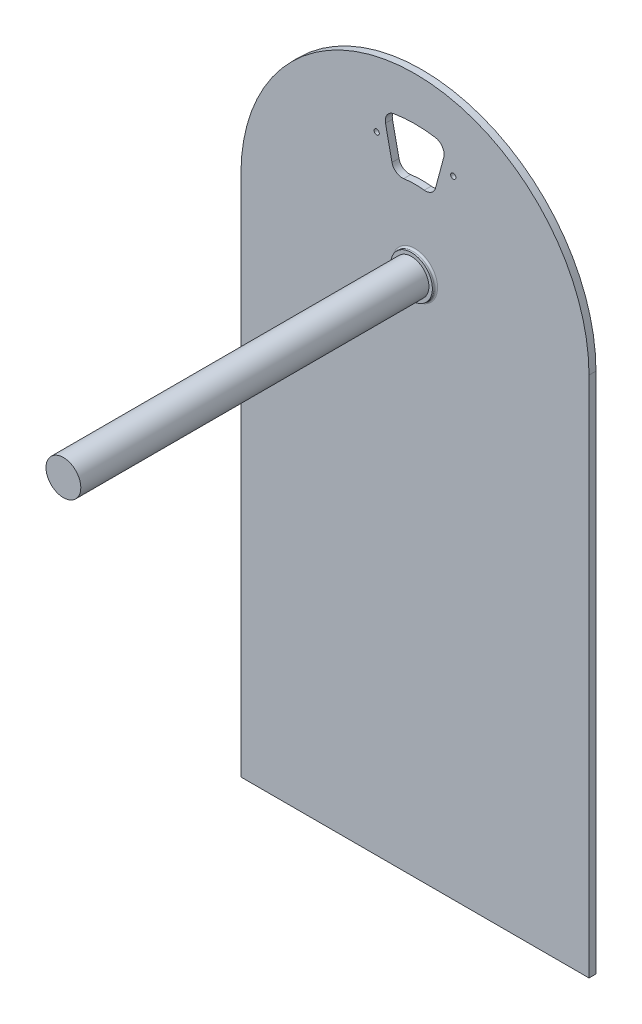
ISO-10303-21;
HEADER;
FILE_DESCRIPTION(('STEP AP214'),'2;1');
FILE_NAME('part.step','',(''),(''),'','','');
FILE_SCHEMA(('AUTOMOTIVE_DESIGN { 1 0 10303 214 1 1 1 1 }'));
ENDSEC;
DATA;
#1=APPLICATION_CONTEXT('core data for automotive mechanical design processes');
#2=APPLICATION_PROTOCOL_DEFINITION('international standard','automotive_design',2000,#1);
#3=PRODUCT_CONTEXT('',#1,'mechanical');
#4=PRODUCT('Part','Part','',(#3));
#5=PRODUCT_RELATED_PRODUCT_CATEGORY('part','',(#4));
#6=PRODUCT_DEFINITION_FORMATION('','',#4);
#7=PRODUCT_DEFINITION_CONTEXT('part definition',#1,'design');
#8=PRODUCT_DEFINITION('design','',#6,#7);
#9=PRODUCT_DEFINITION_SHAPE('','',#8);
#10=(LENGTH_UNIT() NAMED_UNIT(*) SI_UNIT(.MILLI.,.METRE.));
#11=(NAMED_UNIT(*) PLANE_ANGLE_UNIT() SI_UNIT($,.RADIAN.));
#12=(NAMED_UNIT(*) SI_UNIT($,.STERADIAN.) SOLID_ANGLE_UNIT());
#13=UNCERTAINTY_MEASURE_WITH_UNIT(LENGTH_MEASURE(1.E-05),#10,'distance_accuracy_value','');
#14=(GEOMETRIC_REPRESENTATION_CONTEXT(3) GLOBAL_UNCERTAINTY_ASSIGNED_CONTEXT((#13)) GLOBAL_UNIT_ASSIGNED_CONTEXT((#10,
#11,#12)) REPRESENTATION_CONTEXT('',''));
#15=CARTESIAN_POINT('',(0.,0.,0.));
#16=DIRECTION('',(0.,0.,1.));
#17=DIRECTION('',(1.,0.,0.));
#18=AXIS2_PLACEMENT_3D('',#15,#16,#17);
#19=CARTESIAN_POINT('',(0.,0.,2.));
#20=DIRECTION('',(0.,0.,1.));
#21=DIRECTION('',(1.,0.,0.));
#22=AXIS2_PLACEMENT_3D('',#19,#20,#21);
#23=PLANE('',#22);
#24=CARTESIAN_POINT('',(0.,0.,2.));
#25=DIRECTION('',(0.,0.,1.));
#26=DIRECTION('',(1.,0.,0.));
#27=AXIS2_PLACEMENT_3D('',#24,#25,#26);
#28=CIRCLE('',#27,6.5);
#29=CARTESIAN_POINT('',(6.5,0.,2.));
#30=VERTEX_POINT('',#29);
#31=EDGE_CURVE('E11',#30,#30,#28,.F.);
#32=ORIENTED_EDGE('',*,*,#31,.T.);
#33=EDGE_LOOP('',(#32));
#34=FACE_BOUND('',#33,.T.);
#35=DIRECTION('',(0.,1.,0.));
#36=VECTOR('',#35,1.);
#37=CARTESIAN_POINT('',(50.,-150.,2.));
#38=LINE('',#37,#36);
#39=CARTESIAN_POINT('',(50.,-150.,2.));
#40=VERTEX_POINT('',#39);
#41=CARTESIAN_POINT('',(50.,0.,2.));
#42=VERTEX_POINT('',#41);
#43=EDGE_CURVE('E146',#40,#42,#38,.T.);
#44=ORIENTED_EDGE('',*,*,#43,.T.);
#45=CARTESIAN_POINT('',(0.,0.,2.));
#46=DIRECTION('',(0.,0.,1.));
#47=DIRECTION('',(1.,0.,0.));
#48=AXIS2_PLACEMENT_3D('',#45,#46,#47);
#49=CIRCLE('',#48,50.);
#50=CARTESIAN_POINT('',(-50.,0.,2.));
#51=VERTEX_POINT('',#50);
#52=EDGE_CURVE('E145',#42,#51,#49,.T.);
#53=ORIENTED_EDGE('',*,*,#52,.T.);
#54=DIRECTION('',(0.,-1.,0.));
#55=VECTOR('',#54,1.);
#56=CARTESIAN_POINT('',(-50.,-150.,2.));
#57=LINE('',#56,#55);
#58=CARTESIAN_POINT('',(-50.,-150.,2.));
#59=VERTEX_POINT('',#58);
#60=EDGE_CURVE('E133',#51,#59,#57,.T.);
#61=ORIENTED_EDGE('',*,*,#60,.T.);
#62=DIRECTION('',(1.,0.,0.));
#63=VECTOR('',#62,1.);
#64=CARTESIAN_POINT('',(-50.,-150.,2.));
#65=LINE('',#64,#63);
#66=EDGE_CURVE('E144',#59,#40,#65,.T.);
#67=ORIENTED_EDGE('',*,*,#66,.T.);
#68=EDGE_LOOP('',(#44,#53,#61,#67));
#69=FACE_BOUND('',#68,.T.);
#70=CARTESIAN_POINT('',(11.,30.,2.));
#71=DIRECTION('',(0.,0.,1.));
#72=DIRECTION('',(1.,0.,0.));
#73=AXIS2_PLACEMENT_3D('',#70,#71,#72);
#74=CIRCLE('',#73,0.75);
#75=CARTESIAN_POINT('',(11.75,30.,2.));
#76=VERTEX_POINT('',#75);
#77=EDGE_CURVE('E169',#76,#76,#74,.T.);
#78=ORIENTED_EDGE('',*,*,#77,.F.);
#79=EDGE_LOOP('',(#78));
#80=FACE_BOUND('',#79,.T.);
#81=CARTESIAN_POINT('',(-10.9999999999998,30.,2.));
#82=DIRECTION('',(0.,0.,1.));
#83=DIRECTION('',(1.,0.,0.));
#84=AXIS2_PLACEMENT_3D('',#81,#82,#83);
#85=CIRCLE('',#84,0.75);
#86=CARTESIAN_POINT('',(-10.2499999999998,30.,2.));
#87=VERTEX_POINT('',#86);
#88=EDGE_CURVE('E162',#87,#87,#85,.T.);
#89=ORIENTED_EDGE('',*,*,#88,.F.);
#90=EDGE_LOOP('',(#89));
#91=FACE_BOUND('',#90,.T.);
#92=DIRECTION('',(0.258819045102509,0.965925826289072,0.));
#93=VECTOR('',#92,1.);
#94=CARTESIAN_POINT('',(8.26740860120209,33.3031124278494,2.));
#95=LINE('',#94,#93);
#96=CARTESIAN_POINT('',(5.9203506607565,24.5437729457981,2.));
#97=VERTEX_POINT('',#96);
#98=CARTESIAN_POINT('',(8.26740860120209,33.3031124278494,2.));
#99=VERTEX_POINT('',#98);
#100=EDGE_CURVE('E184',#97,#99,#95,.T.);
#101=ORIENTED_EDGE('',*,*,#100,.F.);
#102=CARTESIAN_POINT('',(3.02257318188928,25.3202300811056,2.));
#103=DIRECTION('',(0.,0.,1.));
#104=DIRECTION('',(-1.,0.,0.));
#105=AXIS2_PLACEMENT_3D('',#102,#103,#104);
#106=CIRCLE('',#105,3.);
#107=CARTESIAN_POINT('',(2.66697633696114,22.3413794833284,2.));
#108=VERTEX_POINT('',#107);
#109=EDGE_CURVE('E182',#108,#97,#106,.T.);
#110=ORIENTED_EDGE('',*,*,#109,.F.);
#111=CARTESIAN_POINT('',(0.,0.,2.));
#112=DIRECTION('',(0.,0.,-1.));
#113=DIRECTION('',(1.,0.,0.));
#114=AXIS2_PLACEMENT_3D('',#111,#112,#113);
#115=CIRCLE('',#114,22.5);
#116=CARTESIAN_POINT('',(-3.22612506838159,22.2675125921859,2.));
#117=VERTEX_POINT('',#116);
#118=EDGE_CURVE('E198',#117,#108,#115,.T.);
#119=ORIENTED_EDGE('',*,*,#118,.F.);
#120=CARTESIAN_POINT('',(-3.65627507749914,25.2365142711441,2.));
#121=DIRECTION('',(0.,0.,1.));
#122=DIRECTION('',(1.,0.,0.));
#123=AXIS2_PLACEMENT_3D('',#120,#121,#122);
#124=CIRCLE('',#123,3.);
#125=CARTESIAN_POINT('',(-6.59071787970056,24.6127791986908,2.));
#126=VERTEX_POINT('',#125);
#127=EDGE_CURVE('E195',#126,#117,#124,.T.);
#128=ORIENTED_EDGE('',*,*,#127,.F.);
#129=DIRECTION('',(0.207911690817753,-0.978147600733807,0.));
#130=VECTOR('',#129,1.);
#131=CARTESIAN_POINT('',(-8.46489844953987,33.4301055381566,2.));
#132=LINE('',#131,#130);
#133=CARTESIAN_POINT('',(-8.46489844953988,33.4301055381566,2.));
#134=VERTEX_POINT('',#133);
#135=EDGE_CURVE('E193',#134,#126,#132,.T.);
#136=ORIENTED_EDGE('',*,*,#135,.F.);
#137=CARTESIAN_POINT('',(-5.53045564733845,34.0538406106099,2.));
#138=DIRECTION('',(0.,0.,1.));
#139=DIRECTION('',(-1.,0.,0.));
#140=AXIS2_PLACEMENT_3D('',#137,#138,#139);
#141=CIRCLE('',#140,3.00000000000001);
#142=CARTESIAN_POINT('',(-6.01136483406354,37.0150441419673,2.));
#143=VERTEX_POINT('',#142);
#144=EDGE_CURVE('E191',#143,#134,#141,.T.);
#145=ORIENTED_EDGE('',*,*,#144,.F.);
#146=CARTESIAN_POINT('',(0.,0.,2.));
#147=DIRECTION('',(0.,0.,1.));
#148=DIRECTION('',(1.,0.,0.));
#149=AXIS2_PLACEMENT_3D('',#146,#147,#148);
#150=CIRCLE('',#149,37.5);
#151=CARTESIAN_POINT('',(5.8365555677553,37.0430103947358,2.));
#152=VERTEX_POINT('',#151);
#153=EDGE_CURVE('E189',#152,#143,#150,.T.);
#154=ORIENTED_EDGE('',*,*,#153,.F.);
#155=CARTESIAN_POINT('',(5.36963112233488,34.0795695631569,2.));
#156=DIRECTION('',(0.,0.,1.));
#157=DIRECTION('',(1.,0.,0.));
#158=AXIS2_PLACEMENT_3D('',#155,#156,#157);
#159=CIRCLE('',#158,3.00000000000001);
#160=EDGE_CURVE('E187',#99,#152,#159,.T.);
#161=ORIENTED_EDGE('',*,*,#160,.F.);
#162=EDGE_LOOP('',(#101,#110,#119,#128,#136,#145,#154,#161));
#163=FACE_BOUND('',#162,.T.);
#164=ADVANCED_FACE('F41',(#34,#69,#80,#91,#163),#23,.T.);
#165=CARTESIAN_POINT('',(0.,0.,0.));
#166=DIRECTION('',(0.,0.,1.));
#167=DIRECTION('',(1.,0.,0.));
#168=AXIS2_PLACEMENT_3D('',#165,#166,#167);
#169=PLANE('',#168);
#170=CARTESIAN_POINT('',(11.,30.,0.));
#171=DIRECTION('',(0.,0.,-1.));
#172=DIRECTION('',(-1.,0.,0.));
#173=AXIS2_PLACEMENT_3D('',#170,#171,#172);
#174=CIRCLE('',#173,0.75);
#175=CARTESIAN_POINT('',(10.25,30.,0.));
#176=VERTEX_POINT('',#175);
#177=EDGE_CURVE('E159',#176,#176,#174,.T.);
#178=ORIENTED_EDGE('',*,*,#177,.F.);
#179=EDGE_LOOP('',(#178));
#180=FACE_BOUND('',#179,.T.);
#181=CARTESIAN_POINT('',(-10.9999999999998,30.,0.));
#182=DIRECTION('',(0.,0.,-1.));
#183=DIRECTION('',(1.,0.,0.));
#184=AXIS2_PLACEMENT_3D('',#181,#182,#183);
#185=CIRCLE('',#184,0.75);
#186=CARTESIAN_POINT('',(-10.2499999999998,30.,0.));
#187=VERTEX_POINT('',#186);
#188=EDGE_CURVE('E163',#187,#187,#185,.T.);
#189=ORIENTED_EDGE('',*,*,#188,.F.);
#190=EDGE_LOOP('',(#189));
#191=FACE_BOUND('',#190,.T.);
#192=CARTESIAN_POINT('',(0.,0.,0.));
#193=DIRECTION('',(0.,0.,1.));
#194=DIRECTION('',(1.,0.,0.));
#195=AXIS2_PLACEMENT_3D('',#192,#193,#194);
#196=CIRCLE('',#195,50.);
#197=CARTESIAN_POINT('',(50.,0.,0.));
#198=VERTEX_POINT('',#197);
#199=CARTESIAN_POINT('',(-50.,0.,0.));
#200=VERTEX_POINT('',#199);
#201=EDGE_CURVE('E56',#198,#200,#196,.T.);
#202=ORIENTED_EDGE('',*,*,#201,.F.);
#203=DIRECTION('',(0.,-1.,0.));
#204=VECTOR('',#203,1.);
#205=CARTESIAN_POINT('',(50.,-150.,0.));
#206=LINE('',#205,#204);
#207=CARTESIAN_POINT('',(50.,-150.,0.));
#208=VERTEX_POINT('',#207);
#209=EDGE_CURVE('E166',#198,#208,#206,.T.);
#210=ORIENTED_EDGE('',*,*,#209,.T.);
#211=DIRECTION('',(-1.,0.,0.));
#212=VECTOR('',#211,1.);
#213=CARTESIAN_POINT('',(-50.,-150.,0.));
#214=LINE('',#213,#212);
#215=CARTESIAN_POINT('',(-50.,-150.,0.));
#216=VERTEX_POINT('',#215);
#217=EDGE_CURVE('E289',#208,#216,#214,.T.);
#218=ORIENTED_EDGE('',*,*,#217,.T.);
#219=DIRECTION('',(0.,1.,0.));
#220=VECTOR('',#219,1.);
#221=CARTESIAN_POINT('',(-50.,-150.,0.));
#222=LINE('',#221,#220);
#223=EDGE_CURVE('E134',#216,#200,#222,.T.);
#224=ORIENTED_EDGE('',*,*,#223,.T.);
#225=EDGE_LOOP('',(#202,#210,#218,#224));
#226=FACE_BOUND('',#225,.T.);
#227=CARTESIAN_POINT('',(3.02257318188928,25.3202300811056,0.));
#228=DIRECTION('',(0.,0.,1.));
#229=DIRECTION('',(-1.,0.,0.));
#230=AXIS2_PLACEMENT_3D('',#227,#228,#229);
#231=CIRCLE('',#230,3.);
#232=CARTESIAN_POINT('',(2.66697633696114,22.3413794833284,0.));
#233=VERTEX_POINT('',#232);
#234=CARTESIAN_POINT('',(5.9203506607565,24.5437729457981,0.));
#235=VERTEX_POINT('',#234);
#236=EDGE_CURVE('E181',#233,#235,#231,.T.);
#237=ORIENTED_EDGE('',*,*,#236,.T.);
#238=DIRECTION('',(0.258819045102509,0.965925826289072,0.));
#239=VECTOR('',#238,1.);
#240=CARTESIAN_POINT('',(8.26740860120209,33.3031124278494,0.));
#241=LINE('',#240,#239);
#242=CARTESIAN_POINT('',(8.26740860120209,33.3031124278494,0.));
#243=VERTEX_POINT('',#242);
#244=EDGE_CURVE('E203',#235,#243,#241,.T.);
#245=ORIENTED_EDGE('',*,*,#244,.T.);
#246=CARTESIAN_POINT('',(5.36963112233488,34.0795695631569,0.));
#247=DIRECTION('',(0.,0.,1.));
#248=DIRECTION('',(1.,0.,0.));
#249=AXIS2_PLACEMENT_3D('',#246,#247,#248);
#250=CIRCLE('',#249,3.00000000000001);
#251=CARTESIAN_POINT('',(5.8365555677553,37.0430103947358,0.));
#252=VERTEX_POINT('',#251);
#253=EDGE_CURVE('E206',#243,#252,#250,.T.);
#254=ORIENTED_EDGE('',*,*,#253,.T.);
#255=CARTESIAN_POINT('',(0.,0.,0.));
#256=DIRECTION('',(0.,0.,1.));
#257=DIRECTION('',(1.,0.,0.));
#258=AXIS2_PLACEMENT_3D('',#255,#256,#257);
#259=CIRCLE('',#258,37.5);
#260=CARTESIAN_POINT('',(-6.01136483406354,37.0150441419673,0.));
#261=VERTEX_POINT('',#260);
#262=EDGE_CURVE('E209',#252,#261,#259,.T.);
#263=ORIENTED_EDGE('',*,*,#262,.T.);
#264=CARTESIAN_POINT('',(-5.53045564733845,34.0538406106099,0.));
#265=DIRECTION('',(0.,0.,1.));
#266=DIRECTION('',(-1.,0.,0.));
#267=AXIS2_PLACEMENT_3D('',#264,#265,#266);
#268=CIRCLE('',#267,3.00000000000001);
#269=CARTESIAN_POINT('',(-8.46489844953988,33.4301055381566,0.));
#270=VERTEX_POINT('',#269);
#271=EDGE_CURVE('E212',#261,#270,#268,.T.);
#272=ORIENTED_EDGE('',*,*,#271,.T.);
#273=DIRECTION('',(0.207911690817753,-0.978147600733807,0.));
#274=VECTOR('',#273,1.);
#275=CARTESIAN_POINT('',(-8.46489844953987,33.4301055381566,0.));
#276=LINE('',#275,#274);
#277=CARTESIAN_POINT('',(-6.59071787970056,24.6127791986908,0.));
#278=VERTEX_POINT('',#277);
#279=EDGE_CURVE('E215',#270,#278,#276,.T.);
#280=ORIENTED_EDGE('',*,*,#279,.T.);
#281=CARTESIAN_POINT('',(-3.65627507749914,25.2365142711441,0.));
#282=DIRECTION('',(0.,0.,1.));
#283=DIRECTION('',(1.,0.,0.));
#284=AXIS2_PLACEMENT_3D('',#281,#282,#283);
#285=CIRCLE('',#284,3.);
#286=CARTESIAN_POINT('',(-3.22612506838159,22.2675125921859,0.));
#287=VERTEX_POINT('',#286);
#288=EDGE_CURVE('E218',#278,#287,#285,.T.);
#289=ORIENTED_EDGE('',*,*,#288,.T.);
#290=CARTESIAN_POINT('',(0.,0.,0.));
#291=DIRECTION('',(0.,0.,-1.));
#292=DIRECTION('',(1.,0.,0.));
#293=AXIS2_PLACEMENT_3D('',#290,#291,#292);
#294=CIRCLE('',#293,22.5);
#295=EDGE_CURVE('E185',#287,#233,#294,.T.);
#296=ORIENTED_EDGE('',*,*,#295,.T.);
#297=EDGE_LOOP('',(#237,#245,#254,#263,#272,#280,#289,#296));
#298=FACE_BOUND('',#297,.T.);
#299=ADVANCED_FACE('F265',(#180,#191,#226,#298),#169,.F.);
#300=CARTESIAN_POINT('',(0.,0.,2.));
#301=DIRECTION('',(0.,0.,-1.));
#302=DIRECTION('',(-1.,0.,0.));
#303=AXIS2_PLACEMENT_3D('',#300,#301,#302);
#304=CYLINDRICAL_SURFACE('',#303,50.);
#305=ORIENTED_EDGE('',*,*,#52,.F.);
#306=DIRECTION('',(0.,0.,1.));
#307=VECTOR('',#306,1.);
#308=CARTESIAN_POINT('',(50.,0.,-180.277563773199));
#309=LINE('',#308,#307);
#310=EDGE_CURVE('E151',#198,#42,#309,.T.);
#311=ORIENTED_EDGE('',*,*,#310,.F.);
#312=ORIENTED_EDGE('',*,*,#201,.T.);
#313=DIRECTION('',(0.,0.,1.));
#314=VECTOR('',#313,1.);
#315=CARTESIAN_POINT('',(-50.,0.,-180.277563773199));
#316=LINE('',#315,#314);
#317=EDGE_CURVE('E61',#200,#51,#316,.T.);
#318=ORIENTED_EDGE('',*,*,#317,.T.);
#319=EDGE_LOOP('',(#305,#311,#312,#318));
#320=FACE_BOUND('',#319,.T.);
#321=ADVANCED_FACE('F272',(#320),#304,.T.);
#322=CARTESIAN_POINT('',(3.02257318188928,25.3202300811056,2.));
#323=DIRECTION('',(0.,0.,-1.));
#324=DIRECTION('',(-1.,0.,0.));
#325=AXIS2_PLACEMENT_3D('',#322,#323,#324);
#326=CYLINDRICAL_SURFACE('',#325,3.);
#327=ORIENTED_EDGE('',*,*,#236,.F.);
#328=DIRECTION('',(0.,0.,-1.));
#329=VECTOR('',#328,1.);
#330=CARTESIAN_POINT('',(2.66697633696114,22.3413794833284,2.));
#331=LINE('',#330,#329);
#332=EDGE_CURVE('E200',#108,#233,#331,.T.);
#333=ORIENTED_EDGE('',*,*,#332,.F.);
#334=ORIENTED_EDGE('',*,*,#109,.T.);
#335=DIRECTION('',(0.,0.,-1.));
#336=VECTOR('',#335,1.);
#337=CARTESIAN_POINT('',(5.9203506607565,24.5437729457981,2.));
#338=LINE('',#337,#336);
#339=EDGE_CURVE('E237',#97,#235,#338,.T.);
#340=ORIENTED_EDGE('',*,*,#339,.T.);
#341=EDGE_LOOP('',(#327,#333,#334,#340));
#342=FACE_BOUND('',#341,.T.);
#343=ADVANCED_FACE('F276',(#342),#326,.F.);
#344=CARTESIAN_POINT('',(8.26740860120209,33.3031124278494,2.));
#345=DIRECTION('',(-0.965925826289072,0.258819045102509,0.));
#346=DIRECTION('',(-0.258819045102509,-0.965925826289072,0.));
#347=AXIS2_PLACEMENT_3D('',#344,#345,#346);
#348=PLANE('',#347);
#349=ORIENTED_EDGE('',*,*,#244,.F.);
#350=ORIENTED_EDGE('',*,*,#339,.F.);
#351=ORIENTED_EDGE('',*,*,#100,.T.);
#352=DIRECTION('',(0.,0.,-1.));
#353=VECTOR('',#352,1.);
#354=CARTESIAN_POINT('',(8.26740860120209,33.3031124278494,2.));
#355=LINE('',#354,#353);
#356=EDGE_CURVE('E235',#99,#243,#355,.T.);
#357=ORIENTED_EDGE('',*,*,#356,.T.);
#358=EDGE_LOOP('',(#349,#350,#351,#357));
#359=FACE_BOUND('',#358,.T.);
#360=ADVANCED_FACE('F282',(#359),#348,.T.);
#361=CARTESIAN_POINT('',(5.36963112233488,34.0795695631569,2.));
#362=DIRECTION('',(0.,0.,-1.));
#363=DIRECTION('',(-1.,0.,0.));
#364=AXIS2_PLACEMENT_3D('',#361,#362,#363);
#365=CYLINDRICAL_SURFACE('',#364,3.00000000000001);
#366=ORIENTED_EDGE('',*,*,#253,.F.);
#367=ORIENTED_EDGE('',*,*,#356,.F.);
#368=ORIENTED_EDGE('',*,*,#160,.T.);
#369=DIRECTION('',(0.,0.,-1.));
#370=VECTOR('',#369,1.);
#371=CARTESIAN_POINT('',(5.8365555677553,37.0430103947358,2.));
#372=LINE('',#371,#370);
#373=EDGE_CURVE('E233',#152,#252,#372,.T.);
#374=ORIENTED_EDGE('',*,*,#373,.T.);
#375=EDGE_LOOP('',(#366,#367,#368,#374));
#376=FACE_BOUND('',#375,.T.);
#377=ADVANCED_FACE('F309',(#376),#365,.F.);
#378=CARTESIAN_POINT('',(0.,0.,2.));
#379=DIRECTION('',(0.,0.,-1.));
#380=DIRECTION('',(-1.,0.,0.));
#381=AXIS2_PLACEMENT_3D('',#378,#379,#380);
#382=CYLINDRICAL_SURFACE('',#381,37.5);
#383=ORIENTED_EDGE('',*,*,#262,.F.);
#384=ORIENTED_EDGE('',*,*,#373,.F.);
#385=ORIENTED_EDGE('',*,*,#153,.T.);
#386=DIRECTION('',(0.,0.,-1.));
#387=VECTOR('',#386,1.);
#388=CARTESIAN_POINT('',(-6.01136483406354,37.0150441419673,2.));
#389=LINE('',#388,#387);
#390=EDGE_CURVE('E231',#143,#261,#389,.T.);
#391=ORIENTED_EDGE('',*,*,#390,.T.);
#392=EDGE_LOOP('',(#383,#384,#385,#391));
#393=FACE_BOUND('',#392,.T.);
#394=ADVANCED_FACE('F314',(#393),#382,.F.);
#395=CARTESIAN_POINT('',(-5.53045564733845,34.0538406106099,2.));
#396=DIRECTION('',(0.,0.,-1.));
#397=DIRECTION('',(-1.,0.,0.));
#398=AXIS2_PLACEMENT_3D('',#395,#396,#397);
#399=CYLINDRICAL_SURFACE('',#398,3.00000000000001);
#400=ORIENTED_EDGE('',*,*,#271,.F.);
#401=ORIENTED_EDGE('',*,*,#390,.F.);
#402=ORIENTED_EDGE('',*,*,#144,.T.);
#403=DIRECTION('',(0.,0.,-1.));
#404=VECTOR('',#403,1.);
#405=CARTESIAN_POINT('',(-8.46489844953988,33.4301055381566,2.));
#406=LINE('',#405,#404);
#407=EDGE_CURVE('E229',#134,#270,#406,.T.);
#408=ORIENTED_EDGE('',*,*,#407,.T.);
#409=EDGE_LOOP('',(#400,#401,#402,#408));
#410=FACE_BOUND('',#409,.T.);
#411=ADVANCED_FACE('F319',(#410),#399,.F.);
#412=CARTESIAN_POINT('',(-8.46489844953987,33.4301055381566,2.));
#413=DIRECTION('',(0.978147600733807,0.207911690817753,0.));
#414=DIRECTION('',(-0.207911690817753,0.978147600733807,0.));
#415=AXIS2_PLACEMENT_3D('',#412,#413,#414);
#416=PLANE('',#415);
#417=ORIENTED_EDGE('',*,*,#279,.F.);
#418=ORIENTED_EDGE('',*,*,#407,.F.);
#419=ORIENTED_EDGE('',*,*,#135,.T.);
#420=DIRECTION('',(0.,0.,-1.));
#421=VECTOR('',#420,1.);
#422=CARTESIAN_POINT('',(-6.59071787970056,24.6127791986908,2.));
#423=LINE('',#422,#421);
#424=EDGE_CURVE('E227',#126,#278,#423,.T.);
#425=ORIENTED_EDGE('',*,*,#424,.T.);
#426=EDGE_LOOP('',(#417,#418,#419,#425));
#427=FACE_BOUND('',#426,.T.);
#428=ADVANCED_FACE('F323',(#427),#416,.T.);
#429=CARTESIAN_POINT('',(-3.65627507749914,25.2365142711441,2.));
#430=DIRECTION('',(0.,0.,-1.));
#431=DIRECTION('',(-1.,0.,0.));
#432=AXIS2_PLACEMENT_3D('',#429,#430,#431);
#433=CYLINDRICAL_SURFACE('',#432,3.);
#434=ORIENTED_EDGE('',*,*,#288,.F.);
#435=ORIENTED_EDGE('',*,*,#424,.F.);
#436=ORIENTED_EDGE('',*,*,#127,.T.);
#437=DIRECTION('',(0.,0.,-1.));
#438=VECTOR('',#437,1.);
#439=CARTESIAN_POINT('',(-3.22612506838159,22.2675125921859,2.));
#440=LINE('',#439,#438);
#441=EDGE_CURVE('E225',#117,#287,#440,.T.);
#442=ORIENTED_EDGE('',*,*,#441,.T.);
#443=EDGE_LOOP('',(#434,#435,#436,#442));
#444=FACE_BOUND('',#443,.T.);
#445=ADVANCED_FACE('F327',(#444),#433,.F.);
#446=CARTESIAN_POINT('',(0.,0.,2.));
#447=DIRECTION('',(0.,0.,-1.));
#448=DIRECTION('',(-1.,0.,0.));
#449=AXIS2_PLACEMENT_3D('',#446,#447,#448);
#450=CYLINDRICAL_SURFACE('',#449,22.5);
#451=ORIENTED_EDGE('',*,*,#295,.F.);
#452=ORIENTED_EDGE('',*,*,#441,.F.);
#453=ORIENTED_EDGE('',*,*,#118,.T.);
#454=ORIENTED_EDGE('',*,*,#332,.T.);
#455=EDGE_LOOP('',(#451,#452,#453,#454));
#456=FACE_BOUND('',#455,.T.);
#457=ADVANCED_FACE('F298',(#456),#450,.T.);
#458=CARTESIAN_POINT('',(0.,0.,3.));
#459=DIRECTION('',(0.,0.,-1.));
#460=DIRECTION('',(-1.,0.,0.));
#461=AXIS2_PLACEMENT_3D('',#458,#459,#460);
#462=CYLINDRICAL_SURFACE('',#461,6.);
#463=CARTESIAN_POINT('',(0.,0.,2.5));
#464=DIRECTION('',(0.,0.,1.));
#465=DIRECTION('',(1.,0.,0.));
#466=AXIS2_PLACEMENT_3D('',#463,#464,#465);
#467=CIRCLE('',#466,6.);
#468=CARTESIAN_POINT('',(6.,0.,2.5));
#469=VERTEX_POINT('',#468);
#470=EDGE_CURVE('E49',#469,#469,#467,.T.);
#471=ORIENTED_EDGE('',*,*,#470,.T.);
#472=EDGE_LOOP('',(#471));
#473=FACE_BOUND('',#472,.T.);
#474=CARTESIAN_POINT('',(0.,0.,3.));
#475=DIRECTION('',(0.,0.,1.));
#476=DIRECTION('',(1.,0.,0.));
#477=AXIS2_PLACEMENT_3D('',#474,#475,#476);
#478=CIRCLE('',#477,6.);
#479=CARTESIAN_POINT('',(6.,0.,3.));
#480=VERTEX_POINT('',#479);
#481=EDGE_CURVE('E175',#480,#480,#478,.T.);
#482=ORIENTED_EDGE('',*,*,#481,.F.);
#483=EDGE_LOOP('',(#482));
#484=FACE_BOUND('',#483,.T.);
#485=ADVANCED_FACE('F244',(#473,#484),#462,.T.);
#486=CARTESIAN_POINT('',(0.,0.,3.));
#487=DIRECTION('',(0.,0.,1.));
#488=DIRECTION('',(1.,0.,0.));
#489=AXIS2_PLACEMENT_3D('',#486,#487,#488);
#490=PLANE('',#489);
#491=CARTESIAN_POINT('',(0.,0.,3.));
#492=DIRECTION('',(0.,0.,1.));
#493=DIRECTION('',(1.,0.,0.));
#494=AXIS2_PLACEMENT_3D('',#491,#492,#493);
#495=CIRCLE('',#494,5.);
#496=CARTESIAN_POINT('',(5.,0.,3.));
#497=VERTEX_POINT('',#496);
#498=EDGE_CURVE('E176',#497,#497,#495,.T.);
#499=ORIENTED_EDGE('',*,*,#498,.F.);
#500=EDGE_LOOP('',(#499));
#501=FACE_BOUND('',#500,.T.);
#502=ORIENTED_EDGE('',*,*,#481,.T.);
#503=EDGE_LOOP('',(#502));
#504=FACE_BOUND('',#503,.T.);
#505=ADVANCED_FACE('F385',(#501,#504),#490,.T.);
#506=CARTESIAN_POINT('',(0.,0.,103.));
#507=DIRECTION('',(0.,0.,-1.));
#508=DIRECTION('',(-1.,0.,0.));
#509=AXIS2_PLACEMENT_3D('',#506,#507,#508);
#510=CYLINDRICAL_SURFACE('',#509,5.);
#511=CARTESIAN_POINT('',(0.,0.,103.));
#512=DIRECTION('',(0.,0.,1.));
#513=DIRECTION('',(1.,0.,0.));
#514=AXIS2_PLACEMENT_3D('',#511,#512,#513);
#515=CIRCLE('',#514,5.);
#516=CARTESIAN_POINT('',(5.,0.,103.));
#517=VERTEX_POINT('',#516);
#518=EDGE_CURVE('E172',#517,#517,#515,.T.);
#519=ORIENTED_EDGE('',*,*,#518,.F.);
#520=EDGE_LOOP('',(#519));
#521=FACE_BOUND('',#520,.T.);
#522=ORIENTED_EDGE('',*,*,#498,.T.);
#523=EDGE_LOOP('',(#522));
#524=FACE_BOUND('',#523,.T.);
#525=ADVANCED_FACE('F260',(#521,#524),#510,.T.);
#526=CARTESIAN_POINT('',(0.,0.,103.));
#527=DIRECTION('',(0.,0.,1.));
#528=DIRECTION('',(1.,0.,0.));
#529=AXIS2_PLACEMENT_3D('',#526,#527,#528);
#530=PLANE('',#529);
#531=ORIENTED_EDGE('',*,*,#518,.T.);
#532=EDGE_LOOP('',(#531));
#533=FACE_BOUND('',#532,.T.);
#534=ADVANCED_FACE('F249',(#533),#530,.T.);
#535=CARTESIAN_POINT('',(0.,0.,2.5));
#536=DIRECTION('',(0.,0.,1.));
#537=DIRECTION('',(1.,0.,0.));
#538=AXIS2_PLACEMENT_3D('',#535,#536,#537);
#539=TOROIDAL_SURFACE('',#538,6.5,0.5);
#540=ORIENTED_EDGE('',*,*,#31,.F.);
#541=EDGE_LOOP('',(#540));
#542=FACE_BOUND('',#541,.T.);
#543=ORIENTED_EDGE('',*,*,#470,.F.);
#544=EDGE_LOOP('',(#543));
#545=FACE_BOUND('',#544,.T.);
#546=ADVANCED_FACE('F43',(#542,#545),#539,.F.);
#547=CARTESIAN_POINT('',(-10.9999999999998,30.,10.));
#548=DIRECTION('',(0.,0.,-1.));
#549=DIRECTION('',(-1.,0.,0.));
#550=AXIS2_PLACEMENT_3D('',#547,#548,#549);
#551=CYLINDRICAL_SURFACE('',#550,0.75);
#552=ORIENTED_EDGE('',*,*,#88,.T.);
#553=EDGE_LOOP('',(#552));
#554=FACE_BOUND('',#553,.T.);
#555=ORIENTED_EDGE('',*,*,#188,.T.);
#556=EDGE_LOOP('',(#555));
#557=FACE_BOUND('',#556,.T.);
#558=ADVANCED_FACE('F248',(#554,#557),#551,.F.);
#559=CARTESIAN_POINT('',(11.,30.,10.));
#560=DIRECTION('',(0.,0.,-1.));
#561=DIRECTION('',(-1.,0.,0.));
#562=AXIS2_PLACEMENT_3D('',#559,#560,#561);
#563=CYLINDRICAL_SURFACE('',#562,0.75);
#564=ORIENTED_EDGE('',*,*,#77,.T.);
#565=EDGE_LOOP('',(#564));
#566=FACE_BOUND('',#565,.T.);
#567=ORIENTED_EDGE('',*,*,#177,.T.);
#568=EDGE_LOOP('',(#567));
#569=FACE_BOUND('',#568,.T.);
#570=ADVANCED_FACE('F256',(#566,#569),#563,.F.);
#571=CARTESIAN_POINT('',(50.,-150.,-180.277563773199));
#572=DIRECTION('',(1.,0.,0.));
#573=DIRECTION('',(0.,1.,0.));
#574=AXIS2_PLACEMENT_3D('',#571,#572,#573);
#575=PLANE('',#574);
#576=ORIENTED_EDGE('',*,*,#209,.F.);
#577=ORIENTED_EDGE('',*,*,#310,.T.);
#578=ORIENTED_EDGE('',*,*,#43,.F.);
#579=DIRECTION('',(0.,0.,1.));
#580=VECTOR('',#579,1.);
#581=CARTESIAN_POINT('',(50.,-150.,-180.277563773199));
#582=LINE('',#581,#580);
#583=EDGE_CURVE('E138',#208,#40,#582,.T.);
#584=ORIENTED_EDGE('',*,*,#583,.F.);
#585=EDGE_LOOP('',(#576,#577,#578,#584));
#586=FACE_BOUND('',#585,.T.);
#587=ADVANCED_FACE('F286',(#586),#575,.T.);
#588=CARTESIAN_POINT('',(-50.,-150.,-180.277563773199));
#589=DIRECTION('',(0.,-1.,0.));
#590=DIRECTION('',(0.,0.,-1.));
#591=AXIS2_PLACEMENT_3D('',#588,#589,#590);
#592=PLANE('',#591);
#593=ORIENTED_EDGE('',*,*,#217,.F.);
#594=ORIENTED_EDGE('',*,*,#583,.T.);
#595=ORIENTED_EDGE('',*,*,#66,.F.);
#596=DIRECTION('',(0.,0.,1.));
#597=VECTOR('',#596,1.);
#598=CARTESIAN_POINT('',(-50.,-150.,-180.277563773199));
#599=LINE('',#598,#597);
#600=EDGE_CURVE('E130',#216,#59,#599,.T.);
#601=ORIENTED_EDGE('',*,*,#600,.F.);
#602=EDGE_LOOP('',(#593,#594,#595,#601));
#603=FACE_BOUND('',#602,.T.);
#604=ADVANCED_FACE('F148',(#603),#592,.T.);
#605=CARTESIAN_POINT('',(-50.,-150.,-180.277563773199));
#606=DIRECTION('',(-1.,0.,0.));
#607=DIRECTION('',(0.,-1.,0.));
#608=AXIS2_PLACEMENT_3D('',#605,#606,#607);
#609=PLANE('',#608);
#610=ORIENTED_EDGE('',*,*,#223,.F.);
#611=ORIENTED_EDGE('',*,*,#600,.T.);
#612=ORIENTED_EDGE('',*,*,#60,.F.);
#613=ORIENTED_EDGE('',*,*,#317,.F.);
#614=EDGE_LOOP('',(#610,#611,#612,#613));
#615=FACE_BOUND('',#614,.T.);
#616=ADVANCED_FACE('F132',(#615),#609,.T.);
#617=CLOSED_SHELL('',(#164,#299,#321,#343,#360,#377,#394,#411,#428,#445,#457,#485,#505,#525,
#534,#546,#558,#570,#587,#604,#616));
#618=MANIFOLD_SOLID_BREP('B2',#617);
#619=ADVANCED_BREP_SHAPE_REPRESENTATION('',(#18,#618),#14);
#620=SHAPE_DEFINITION_REPRESENTATION(#9,#619);
ENDSEC;
END-ISO-10303-21;
